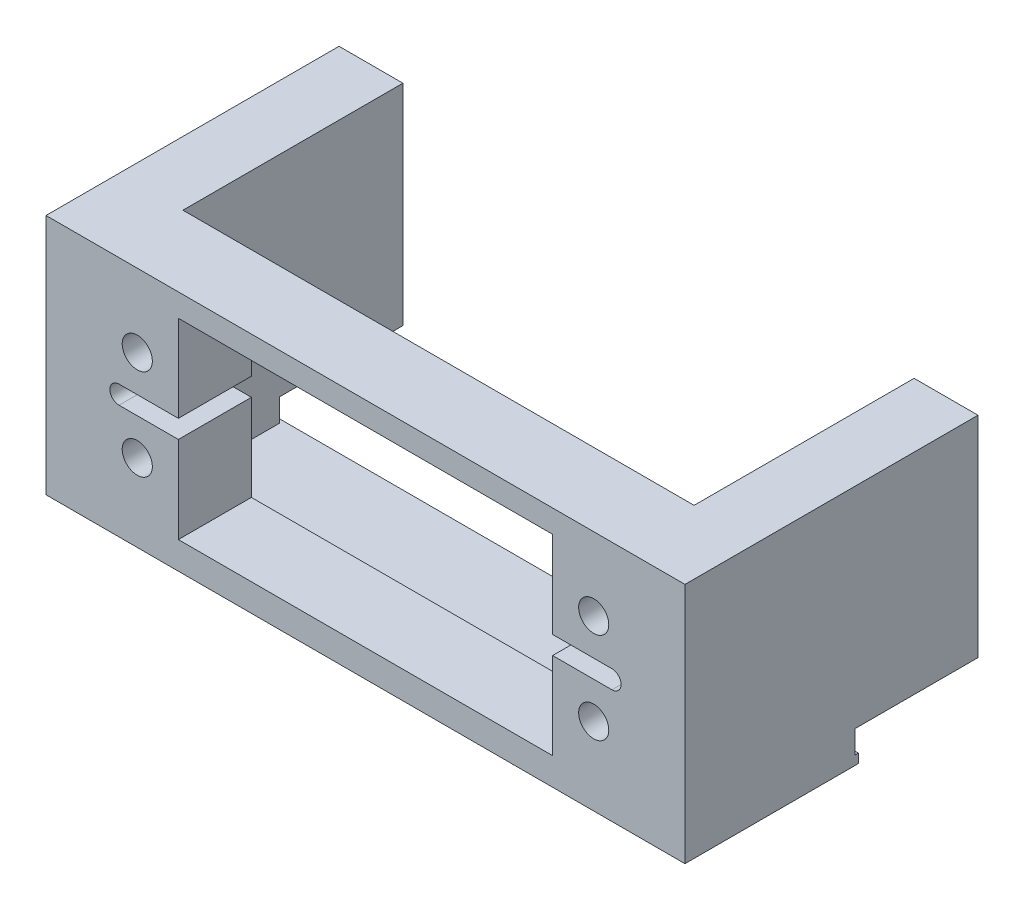
ISO-10303-21;
HEADER;
FILE_DESCRIPTION(('STEP AP214'),'2;1');
FILE_NAME('part.step','',(''),(''),'','','');
FILE_SCHEMA(('AUTOMOTIVE_DESIGN { 1 0 10303 214 1 1 1 1 }'));
ENDSEC;
DATA;
#1=APPLICATION_CONTEXT('core data for automotive mechanical design processes');
#2=APPLICATION_PROTOCOL_DEFINITION('international standard','automotive_design',2000,#1);
#3=PRODUCT_CONTEXT('',#1,'mechanical');
#4=PRODUCT('Part','Part','',(#3));
#5=PRODUCT_RELATED_PRODUCT_CATEGORY('part','',(#4));
#6=PRODUCT_DEFINITION_FORMATION('','',#4);
#7=PRODUCT_DEFINITION_CONTEXT('part definition',#1,'design');
#8=PRODUCT_DEFINITION('design','',#6,#7);
#9=PRODUCT_DEFINITION_SHAPE('','',#8);
#10=(LENGTH_UNIT() NAMED_UNIT(*) SI_UNIT(.MILLI.,.METRE.));
#11=(NAMED_UNIT(*) PLANE_ANGLE_UNIT() SI_UNIT($,.RADIAN.));
#12=(NAMED_UNIT(*) SI_UNIT($,.STERADIAN.) SOLID_ANGLE_UNIT());
#13=UNCERTAINTY_MEASURE_WITH_UNIT(LENGTH_MEASURE(1.E-05),#10,'distance_accuracy_value','');
#14=(GEOMETRIC_REPRESENTATION_CONTEXT(3) GLOBAL_UNCERTAINTY_ASSIGNED_CONTEXT((#13)) GLOBAL_UNIT_ASSIGNED_CONTEXT((#10,
#11,#12)) REPRESENTATION_CONTEXT('',''));
#15=CARTESIAN_POINT('',(0.,0.,0.));
#16=DIRECTION('',(0.,0.,1.));
#17=DIRECTION('',(1.,0.,0.));
#18=AXIS2_PLACEMENT_3D('',#15,#16,#17);
#19=CARTESIAN_POINT('',(0.,0.,-24.1));
#20=DIRECTION('',(0.,0.,-1.));
#21=DIRECTION('',(-1.,0.,0.));
#22=AXIS2_PLACEMENT_3D('',#19,#20,#21);
#23=PLANE('',#22);
#24=CARTESIAN_POINT('',(31.5,0.,-24.1));
#25=DIRECTION('',(0.,0.,-1.));
#26=DIRECTION('',(-1.,0.,0.));
#27=AXIS2_PLACEMENT_3D('',#24,#25,#26);
#28=CIRCLE('',#27,1.65);
#29=CARTESIAN_POINT('',(29.85,0.,-24.1));
#30=VERTEX_POINT('',#29);
#31=EDGE_CURVE('E296',#30,#30,#28,.T.);
#32=ORIENTED_EDGE('',*,*,#31,.F.);
#33=EDGE_LOOP('',(#32));
#34=FACE_BOUND('',#33,.T.);
#35=DIRECTION('',(0.,-1.,0.));
#36=VECTOR('',#35,1.);
#37=CARTESIAN_POINT('',(35.,0.,-24.1));
#38=LINE('',#37,#36);
#39=CARTESIAN_POINT('',(35.,12.5,-24.1));
#40=VERTEX_POINT('',#39);
#41=CARTESIAN_POINT('',(35.,-10.5,-24.1));
#42=VERTEX_POINT('',#41);
#43=EDGE_CURVE('E320',#40,#42,#38,.T.);
#44=ORIENTED_EDGE('',*,*,#43,.T.);
#45=DIRECTION('',(1.,0.,0.));
#46=VECTOR('',#45,1.);
#47=CARTESIAN_POINT('',(35.,-10.5,-24.1));
#48=LINE('',#47,#46);
#49=CARTESIAN_POINT('',(28.,-10.5,-24.1));
#50=VERTEX_POINT('',#49);
#51=EDGE_CURVE('E291',#50,#42,#48,.T.);
#52=ORIENTED_EDGE('',*,*,#51,.F.);
#53=DIRECTION('',(0.,1.,0.));
#54=VECTOR('',#53,1.);
#55=CARTESIAN_POINT('',(28.,0.,-24.1));
#56=LINE('',#55,#54);
#57=CARTESIAN_POINT('',(28.,12.5,-24.1));
#58=VERTEX_POINT('',#57);
#59=EDGE_CURVE('E314',#50,#58,#56,.T.);
#60=ORIENTED_EDGE('',*,*,#59,.T.);
#61=DIRECTION('',(1.,0.,0.));
#62=VECTOR('',#61,1.);
#63=CARTESIAN_POINT('',(0.,12.5,-24.1));
#64=LINE('',#63,#62);
#65=EDGE_CURVE('E316',#58,#40,#64,.T.);
#66=ORIENTED_EDGE('',*,*,#65,.T.);
#67=EDGE_LOOP('',(#44,#52,#60,#66));
#68=FACE_BOUND('',#67,.T.);
#69=ADVANCED_FACE('F37',(#34,#68),#23,.T.);
#70=CARTESIAN_POINT('',(0.,0.,0.));
#71=DIRECTION('',(0.,0.,1.));
#72=DIRECTION('',(1.,0.,0.));
#73=AXIS2_PLACEMENT_3D('',#70,#71,#72);
#74=PLANE('',#73);
#75=CARTESIAN_POINT('',(25.,-5.50000000000001,0.));
#76=DIRECTION('',(0.,0.,1.));
#77=DIRECTION('',(1.,0.,0.));
#78=AXIS2_PLACEMENT_3D('',#75,#76,#77);
#79=CIRCLE('',#78,1.65);
#80=CARTESIAN_POINT('',(26.65,-5.50000000000001,0.));
#81=VERTEX_POINT('',#80);
#82=EDGE_CURVE('E931',#81,#81,#79,.T.);
#83=ORIENTED_EDGE('',*,*,#82,.T.);
#84=EDGE_LOOP('',(#83));
#85=FACE_BOUND('',#84,.T.);
#86=CARTESIAN_POINT('',(-25.,-5.50000000000001,0.));
#87=DIRECTION('',(0.,0.,1.));
#88=DIRECTION('',(1.,0.,0.));
#89=AXIS2_PLACEMENT_3D('',#86,#87,#88);
#90=CIRCLE('',#89,1.65);
#91=CARTESIAN_POINT('',(-23.35,-5.50000000000001,0.));
#92=VERTEX_POINT('',#91);
#93=EDGE_CURVE('E918',#92,#92,#90,.T.);
#94=ORIENTED_EDGE('',*,*,#93,.T.);
#95=EDGE_LOOP('',(#94));
#96=FACE_BOUND('',#95,.T.);
#97=DIRECTION('',(0.,1.,0.));
#98=VECTOR('',#97,1.);
#99=CARTESIAN_POINT('',(28.,0.,0.));
#100=LINE('',#99,#98);
#101=CARTESIAN_POINT('',(28.,-13.,0.));
#102=VERTEX_POINT('',#101);
#103=CARTESIAN_POINT('',(28.,-0.500000000000009,0.));
#104=VERTEX_POINT('',#103);
#105=EDGE_CURVE('E317',#102,#104,#100,.T.);
#106=ORIENTED_EDGE('',*,*,#105,.F.);
#107=DIRECTION('',(1.,0.,0.));
#108=VECTOR('',#107,1.);
#109=CARTESIAN_POINT('',(28.,-13.,0.));
#110=LINE('',#109,#108);
#111=CARTESIAN_POINT('',(-28.,-13.,0.));
#112=VERTEX_POINT('',#111);
#113=EDGE_CURVE('E275',#112,#102,#110,.T.);
#114=ORIENTED_EDGE('',*,*,#113,.F.);
#115=DIRECTION('',(0.,1.,0.));
#116=VECTOR('',#115,1.);
#117=CARTESIAN_POINT('',(-28.,0.,0.));
#118=LINE('',#117,#116);
#119=CARTESIAN_POINT('',(-28.,-0.500000000000009,0.));
#120=VERTEX_POINT('',#119);
#121=EDGE_CURVE('E350',#112,#120,#118,.T.);
#122=ORIENTED_EDGE('',*,*,#121,.T.);
#123=CARTESIAN_POINT('',(-27.,-0.500000000000009,0.));
#124=DIRECTION('',(0.,0.,1.));
#125=DIRECTION('',(1.,0.,0.));
#126=AXIS2_PLACEMENT_3D('',#123,#124,#125);
#127=CIRCLE('',#126,0.999999999999997);
#128=CARTESIAN_POINT('',(-27.,-1.50000000000001,0.));
#129=VERTEX_POINT('',#128);
#130=EDGE_CURVE('E370',#120,#129,#127,.T.);
#131=ORIENTED_EDGE('',*,*,#130,.T.);
#132=DIRECTION('',(1.,0.,0.));
#133=VECTOR('',#132,1.);
#134=CARTESIAN_POINT('',(-27.,-1.50000000000001,0.));
#135=LINE('',#134,#133);
#136=CARTESIAN_POINT('',(-20.5,-1.50000000000001,0.));
#137=VERTEX_POINT('',#136);
#138=EDGE_CURVE('E369',#129,#137,#135,.T.);
#139=ORIENTED_EDGE('',*,*,#138,.T.);
#140=DIRECTION('',(0.,1.,0.));
#141=VECTOR('',#140,1.);
#142=CARTESIAN_POINT('',(-20.5,-11.,0.));
#143=LINE('',#142,#141);
#144=CARTESIAN_POINT('',(-20.5,-11.,0.));
#145=VERTEX_POINT('',#144);
#146=EDGE_CURVE('E395',#145,#137,#143,.T.);
#147=ORIENTED_EDGE('',*,*,#146,.F.);
#148=DIRECTION('',(-1.,0.,0.));
#149=VECTOR('',#148,1.);
#150=CARTESIAN_POINT('',(-20.5,-11.,0.));
#151=LINE('',#150,#149);
#152=CARTESIAN_POINT('',(20.5,-11.,0.));
#153=VERTEX_POINT('',#152);
#154=EDGE_CURVE('E391',#153,#145,#151,.T.);
#155=ORIENTED_EDGE('',*,*,#154,.F.);
#156=DIRECTION('',(0.,-1.,0.));
#157=VECTOR('',#156,1.);
#158=CARTESIAN_POINT('',(20.5,-11.,0.));
#159=LINE('',#158,#157);
#160=CARTESIAN_POINT('',(20.5,-1.5,0.));
#161=VERTEX_POINT('',#160);
#162=EDGE_CURVE('E386',#161,#153,#159,.T.);
#163=ORIENTED_EDGE('',*,*,#162,.F.);
#164=DIRECTION('',(-1.,0.,0.));
#165=VECTOR('',#164,1.);
#166=CARTESIAN_POINT('',(0.,-1.5,0.));
#167=LINE('',#166,#165);
#168=CARTESIAN_POINT('',(27.,-1.50000000000001,0.));
#169=VERTEX_POINT('',#168);
#170=EDGE_CURVE('E342',#169,#161,#167,.T.);
#171=ORIENTED_EDGE('',*,*,#170,.F.);
#172=CARTESIAN_POINT('',(27.,-0.500000000000009,0.));
#173=DIRECTION('',(0.,0.,1.));
#174=DIRECTION('',(1.,0.,0.));
#175=AXIS2_PLACEMENT_3D('',#172,#173,#174);
#176=CIRCLE('',#175,0.999999999999997);
#177=EDGE_CURVE('E45',#104,#169,#176,.F.);
#178=ORIENTED_EDGE('',*,*,#177,.F.);
#179=EDGE_LOOP('',(#106,#114,#122,#131,#139,#147,#155,#163,#171,#178));
#180=FACE_BOUND('',#179,.T.);
#181=ADVANCED_FACE('F451',(#85,#96,#180),#74,.F.);
#182=CARTESIAN_POINT('',(-25.,4.49999999999999,0.));
#183=DIRECTION('',(0.,0.,1.));
#184=DIRECTION('',(1.,0.,0.));
#185=AXIS2_PLACEMENT_3D('',#182,#183,#184);
#186=CIRCLE('',#185,1.65);
#187=CARTESIAN_POINT('',(-23.35,4.49999999999999,0.));
#188=VERTEX_POINT('',#187);
#189=EDGE_CURVE('E913',#188,#188,#186,.T.);
#190=ORIENTED_EDGE('',*,*,#189,.T.);
#191=EDGE_LOOP('',(#190));
#192=FACE_BOUND('',#191,.T.);
#193=CARTESIAN_POINT('',(25.,4.49999999999999,0.));
#194=DIRECTION('',(0.,0.,1.));
#195=DIRECTION('',(1.,0.,0.));
#196=AXIS2_PLACEMENT_3D('',#193,#194,#195);
#197=CIRCLE('',#196,1.65);
#198=CARTESIAN_POINT('',(26.65,4.49999999999999,0.));
#199=VERTEX_POINT('',#198);
#200=EDGE_CURVE('E255',#199,#199,#197,.T.);
#201=ORIENTED_EDGE('',*,*,#200,.T.);
#202=EDGE_LOOP('',(#201));
#203=FACE_BOUND('',#202,.T.);
#204=CARTESIAN_POINT('',(28.,12.5,0.));
#205=VERTEX_POINT('',#204);
#206=EDGE_CURVE('E313',#104,#205,#100,.T.);
#207=ORIENTED_EDGE('',*,*,#206,.F.);
#208=CARTESIAN_POINT('',(27.,0.499999999999988,0.));
#209=VERTEX_POINT('',#208);
#210=EDGE_CURVE('E11',#209,#104,#176,.F.);
#211=ORIENTED_EDGE('',*,*,#210,.F.);
#212=DIRECTION('',(1.,0.,0.));
#213=VECTOR('',#212,1.);
#214=CARTESIAN_POINT('',(0.,0.499999999999993,0.));
#215=LINE('',#214,#213);
#216=CARTESIAN_POINT('',(20.5,0.49999999999999,0.));
#217=VERTEX_POINT('',#216);
#218=EDGE_CURVE('E339',#217,#209,#215,.T.);
#219=ORIENTED_EDGE('',*,*,#218,.F.);
#220=CARTESIAN_POINT('',(20.5,9.99999999999999,0.));
#221=VERTEX_POINT('',#220);
#222=EDGE_CURVE('E388',#221,#217,#159,.T.);
#223=ORIENTED_EDGE('',*,*,#222,.F.);
#224=DIRECTION('',(1.,0.,0.));
#225=VECTOR('',#224,1.);
#226=CARTESIAN_POINT('',(-20.5,9.99999999999999,0.));
#227=LINE('',#226,#225);
#228=CARTESIAN_POINT('',(-20.5,9.99999999999999,0.));
#229=VERTEX_POINT('',#228);
#230=EDGE_CURVE('E398',#229,#221,#227,.T.);
#231=ORIENTED_EDGE('',*,*,#230,.F.);
#232=CARTESIAN_POINT('',(-20.5,0.49999999999999,0.));
#233=VERTEX_POINT('',#232);
#234=EDGE_CURVE('E394',#233,#229,#143,.T.);
#235=ORIENTED_EDGE('',*,*,#234,.F.);
#236=DIRECTION('',(-1.,0.,0.));
#237=VECTOR('',#236,1.);
#238=CARTESIAN_POINT('',(-27.,0.499999999999988,0.));
#239=LINE('',#238,#237);
#240=CARTESIAN_POINT('',(-27.,0.499999999999988,0.));
#241=VERTEX_POINT('',#240);
#242=EDGE_CURVE('E373',#233,#241,#239,.T.);
#243=ORIENTED_EDGE('',*,*,#242,.T.);
#244=EDGE_CURVE('E366',#241,#120,#127,.T.);
#245=ORIENTED_EDGE('',*,*,#244,.T.);
#246=CARTESIAN_POINT('',(-28.,12.5,0.));
#247=VERTEX_POINT('',#246);
#248=EDGE_CURVE('E362',#120,#247,#118,.T.);
#249=ORIENTED_EDGE('',*,*,#248,.T.);
#250=DIRECTION('',(-1.,0.,0.));
#251=VECTOR('',#250,1.);
#252=CARTESIAN_POINT('',(-35.,12.5,0.));
#253=LINE('',#252,#251);
#254=EDGE_CURVE('E234',#205,#247,#253,.T.);
#255=ORIENTED_EDGE('',*,*,#254,.F.);
#256=EDGE_LOOP('',(#207,#211,#219,#223,#231,#235,#243,#245,#249,#255));
#257=FACE_BOUND('',#256,.T.);
#258=ADVANCED_FACE('F469',(#192,#203,#257),#74,.F.);
#259=CARTESIAN_POINT('',(0.,0.,8.));
#260=DIRECTION('',(0.,0.,1.));
#261=DIRECTION('',(1.,0.,0.));
#262=AXIS2_PLACEMENT_3D('',#259,#260,#261);
#263=PLANE('',#262);
#264=CARTESIAN_POINT('',(25.,-5.50000000000001,8.));
#265=DIRECTION('',(0.,0.,1.));
#266=DIRECTION('',(1.,0.,0.));
#267=AXIS2_PLACEMENT_3D('',#264,#265,#266);
#268=CIRCLE('',#267,1.65);
#269=CARTESIAN_POINT('',(26.65,-5.50000000000001,8.));
#270=VERTEX_POINT('',#269);
#271=EDGE_CURVE('E934',#270,#270,#268,.T.);
#272=ORIENTED_EDGE('',*,*,#271,.F.);
#273=EDGE_LOOP('',(#272));
#274=FACE_BOUND('',#273,.T.);
#275=CARTESIAN_POINT('',(-25.,4.49999999999999,8.));
#276=DIRECTION('',(0.,0.,1.));
#277=DIRECTION('',(1.,0.,0.));
#278=AXIS2_PLACEMENT_3D('',#275,#276,#277);
#279=CIRCLE('',#278,1.65);
#280=CARTESIAN_POINT('',(-23.35,4.49999999999999,8.));
#281=VERTEX_POINT('',#280);
#282=EDGE_CURVE('E928',#281,#281,#279,.T.);
#283=ORIENTED_EDGE('',*,*,#282,.F.);
#284=EDGE_LOOP('',(#283));
#285=FACE_BOUND('',#284,.T.);
#286=CARTESIAN_POINT('',(-25.,-5.50000000000001,8.));
#287=DIRECTION('',(0.,0.,1.));
#288=DIRECTION('',(1.,0.,0.));
#289=AXIS2_PLACEMENT_3D('',#286,#287,#288);
#290=CIRCLE('',#289,1.65);
#291=CARTESIAN_POINT('',(-23.35,-5.50000000000001,8.));
#292=VERTEX_POINT('',#291);
#293=EDGE_CURVE('E922',#292,#292,#290,.T.);
#294=ORIENTED_EDGE('',*,*,#293,.F.);
#295=EDGE_LOOP('',(#294));
#296=FACE_BOUND('',#295,.T.);
#297=CARTESIAN_POINT('',(25.,4.49999999999999,8.));
#298=DIRECTION('',(0.,0.,1.));
#299=DIRECTION('',(1.,0.,0.));
#300=AXIS2_PLACEMENT_3D('',#297,#298,#299);
#301=CIRCLE('',#300,1.65);
#302=CARTESIAN_POINT('',(26.65,4.49999999999999,8.));
#303=VERTEX_POINT('',#302);
#304=EDGE_CURVE('E916',#303,#303,#301,.T.);
#305=ORIENTED_EDGE('',*,*,#304,.F.);
#306=EDGE_LOOP('',(#305));
#307=FACE_BOUND('',#306,.T.);
#308=DIRECTION('',(0.,1.,0.));
#309=VECTOR('',#308,1.);
#310=CARTESIAN_POINT('',(35.,12.5,8.));
#311=LINE('',#310,#309);
#312=CARTESIAN_POINT('',(35.,-14.,8.));
#313=VERTEX_POINT('',#312);
#314=CARTESIAN_POINT('',(35.,12.5,8.));
#315=VERTEX_POINT('',#314);
#316=EDGE_CURVE('E225',#313,#315,#311,.T.);
#317=ORIENTED_EDGE('',*,*,#316,.T.);
#318=DIRECTION('',(-1.,0.,0.));
#319=VECTOR('',#318,1.);
#320=CARTESIAN_POINT('',(-35.,12.5,8.));
#321=LINE('',#320,#319);
#322=CARTESIAN_POINT('',(-35.,12.5,8.));
#323=VERTEX_POINT('',#322);
#324=EDGE_CURVE('E233',#315,#323,#321,.T.);
#325=ORIENTED_EDGE('',*,*,#324,.T.);
#326=DIRECTION('',(0.,-1.,0.));
#327=VECTOR('',#326,1.);
#328=CARTESIAN_POINT('',(-35.,12.5,8.));
#329=LINE('',#328,#327);
#330=CARTESIAN_POINT('',(-35.,-14.,7.99999999999999));
#331=VERTEX_POINT('',#330);
#332=EDGE_CURVE('E241',#323,#331,#329,.T.);
#333=ORIENTED_EDGE('',*,*,#332,.T.);
#334=DIRECTION('',(-1.,0.,0.));
#335=VECTOR('',#334,1.);
#336=CARTESIAN_POINT('',(35.,-14.,8.));
#337=LINE('',#336,#335);
#338=EDGE_CURVE('E237',#313,#331,#337,.T.);
#339=ORIENTED_EDGE('',*,*,#338,.F.);
#340=EDGE_LOOP('',(#317,#325,#333,#339));
#341=FACE_BOUND('',#340,.T.);
#342=CARTESIAN_POINT('',(27.,-0.500000000000009,8.));
#343=DIRECTION('',(0.,0.,-1.));
#344=DIRECTION('',(-1.,0.,0.));
#345=AXIS2_PLACEMENT_3D('',#342,#343,#344);
#346=CIRCLE('',#345,0.999999999999997);
#347=CARTESIAN_POINT('',(27.,0.499999999999988,8.));
#348=VERTEX_POINT('',#347);
#349=CARTESIAN_POINT('',(27.,-1.50000000000001,8.));
#350=VERTEX_POINT('',#349);
#351=EDGE_CURVE('E327',#348,#350,#346,.T.);
#352=ORIENTED_EDGE('',*,*,#351,.T.);
#353=DIRECTION('',(-1.,0.,0.));
#354=VECTOR('',#353,1.);
#355=CARTESIAN_POINT('',(27.,-1.50000000000001,8.));
#356=LINE('',#355,#354);
#357=CARTESIAN_POINT('',(20.5,-1.50000000000001,8.));
#358=VERTEX_POINT('',#357);
#359=EDGE_CURVE('E333',#350,#358,#356,.T.);
#360=ORIENTED_EDGE('',*,*,#359,.T.);
#361=DIRECTION('',(0.,1.,0.));
#362=VECTOR('',#361,1.);
#363=CARTESIAN_POINT('',(20.5,0.,8.));
#364=LINE('',#363,#362);
#365=CARTESIAN_POINT('',(20.5,-11.,8.));
#366=VERTEX_POINT('',#365);
#367=EDGE_CURVE('E420',#366,#358,#364,.T.);
#368=ORIENTED_EDGE('',*,*,#367,.F.);
#369=DIRECTION('',(1.,0.,0.));
#370=VECTOR('',#369,1.);
#371=CARTESIAN_POINT('',(0.,-11.,8.));
#372=LINE('',#371,#370);
#373=CARTESIAN_POINT('',(-20.5,-11.,8.));
#374=VERTEX_POINT('',#373);
#375=EDGE_CURVE('E404',#374,#366,#372,.T.);
#376=ORIENTED_EDGE('',*,*,#375,.F.);
#377=DIRECTION('',(0.,-1.,0.));
#378=VECTOR('',#377,1.);
#379=CARTESIAN_POINT('',(-20.5,0.,8.));
#380=LINE('',#379,#378);
#381=CARTESIAN_POINT('',(-20.5,-1.50000000000001,8.));
#382=VERTEX_POINT('',#381);
#383=EDGE_CURVE('E413',#382,#374,#380,.T.);
#384=ORIENTED_EDGE('',*,*,#383,.F.);
#385=DIRECTION('',(1.,0.,0.));
#386=VECTOR('',#385,1.);
#387=CARTESIAN_POINT('',(-27.,-1.50000000000001,8.));
#388=LINE('',#387,#386);
#389=CARTESIAN_POINT('',(-27.,-1.50000000000001,8.));
#390=VERTEX_POINT('',#389);
#391=EDGE_CURVE('E379',#390,#382,#388,.T.);
#392=ORIENTED_EDGE('',*,*,#391,.F.);
#393=CARTESIAN_POINT('',(-27.,-0.500000000000009,8.));
#394=DIRECTION('',(0.,0.,1.));
#395=DIRECTION('',(1.,0.,0.));
#396=AXIS2_PLACEMENT_3D('',#393,#394,#395);
#397=CIRCLE('',#396,0.999999999999997);
#398=CARTESIAN_POINT('',(-27.,0.499999999999988,8.));
#399=VERTEX_POINT('',#398);
#400=EDGE_CURVE('E365',#399,#390,#397,.T.);
#401=ORIENTED_EDGE('',*,*,#400,.F.);
#402=DIRECTION('',(-1.,0.,0.));
#403=VECTOR('',#402,1.);
#404=CARTESIAN_POINT('',(-27.,0.499999999999988,8.));
#405=LINE('',#404,#403);
#406=CARTESIAN_POINT('',(-20.5,0.49999999999999,8.));
#407=VERTEX_POINT('',#406);
#408=EDGE_CURVE('E381',#407,#399,#405,.T.);
#409=ORIENTED_EDGE('',*,*,#408,.F.);
#410=CARTESIAN_POINT('',(-20.5,9.99999999999999,8.));
#411=VERTEX_POINT('',#410);
#412=EDGE_CURVE('E414',#411,#407,#380,.T.);
#413=ORIENTED_EDGE('',*,*,#412,.F.);
#414=DIRECTION('',(-1.,0.,0.));
#415=VECTOR('',#414,1.);
#416=CARTESIAN_POINT('',(0.,9.99999999999999,8.));
#417=LINE('',#416,#415);
#418=CARTESIAN_POINT('',(20.5,9.99999999999999,8.));
#419=VERTEX_POINT('',#418);
#420=EDGE_CURVE('E417',#419,#411,#417,.T.);
#421=ORIENTED_EDGE('',*,*,#420,.F.);
#422=CARTESIAN_POINT('',(20.5,0.499999999999992,8.));
#423=VERTEX_POINT('',#422);
#424=EDGE_CURVE('E419',#423,#419,#364,.T.);
#425=ORIENTED_EDGE('',*,*,#424,.F.);
#426=DIRECTION('',(1.,0.,0.));
#427=VECTOR('',#426,1.);
#428=CARTESIAN_POINT('',(27.,0.499999999999988,8.));
#429=LINE('',#428,#427);
#430=EDGE_CURVE('E330',#423,#348,#429,.T.);
#431=ORIENTED_EDGE('',*,*,#430,.T.);
#432=EDGE_LOOP('',(#352,#360,#368,#376,#384,#392,#401,#409,#413,#421,#425,#431));
#433=FACE_BOUND('',#432,.T.);
#434=ADVANCED_FACE('F238',(#274,#285,#296,#307,#341,#433),#263,.T.);
#435=CARTESIAN_POINT('',(20.5,-11.,24.));
#436=DIRECTION('',(1.,0.,0.));
#437=DIRECTION('',(0.,0.,-1.));
#438=AXIS2_PLACEMENT_3D('',#435,#436,#437);
#439=PLANE('',#438);
#440=DIRECTION('',(0.,0.,1.));
#441=VECTOR('',#440,1.);
#442=CARTESIAN_POINT('',(20.5,-1.5,24.));
#443=LINE('',#442,#441);
#444=EDGE_CURVE('E436',#161,#358,#443,.T.);
#445=ORIENTED_EDGE('',*,*,#444,.F.);
#446=ORIENTED_EDGE('',*,*,#162,.T.);
#447=DIRECTION('',(0.,0.,-1.));
#448=VECTOR('',#447,1.);
#449=CARTESIAN_POINT('',(20.5,-11.,24.));
#450=LINE('',#449,#448);
#451=EDGE_CURVE('E401',#366,#153,#450,.T.);
#452=ORIENTED_EDGE('',*,*,#451,.F.);
#453=ORIENTED_EDGE('',*,*,#367,.T.);
#454=EDGE_LOOP('',(#445,#446,#452,#453));
#455=FACE_BOUND('',#454,.T.);
#456=ADVANCED_FACE('F456',(#455),#439,.F.);
#457=DIRECTION('',(0.,0.,-1.));
#458=VECTOR('',#457,1.);
#459=CARTESIAN_POINT('',(20.5,0.49999999999999,24.));
#460=LINE('',#459,#458);
#461=EDGE_CURVE('E435',#423,#217,#460,.T.);
#462=ORIENTED_EDGE('',*,*,#461,.F.);
#463=ORIENTED_EDGE('',*,*,#424,.T.);
#464=DIRECTION('',(0.,0.,-1.));
#465=VECTOR('',#464,1.);
#466=CARTESIAN_POINT('',(20.5,9.99999999999999,24.));
#467=LINE('',#466,#465);
#468=EDGE_CURVE('E402',#419,#221,#467,.T.);
#469=ORIENTED_EDGE('',*,*,#468,.T.);
#470=ORIENTED_EDGE('',*,*,#222,.T.);
#471=EDGE_LOOP('',(#462,#463,#469,#470));
#472=FACE_BOUND('',#471,.T.);
#473=ADVANCED_FACE('F529',(#472),#439,.F.);
#474=CARTESIAN_POINT('',(-20.5,-11.,24.));
#475=DIRECTION('',(-1.,0.,0.));
#476=DIRECTION('',(0.,0.,1.));
#477=AXIS2_PLACEMENT_3D('',#474,#475,#476);
#478=PLANE('',#477);
#479=ORIENTED_EDGE('',*,*,#412,.T.);
#480=DIRECTION('',(0.,0.,-1.));
#481=VECTOR('',#480,1.);
#482=CARTESIAN_POINT('',(-20.5,0.49999999999999,24.));
#483=LINE('',#482,#481);
#484=EDGE_CURVE('E432',#407,#233,#483,.T.);
#485=ORIENTED_EDGE('',*,*,#484,.T.);
#486=ORIENTED_EDGE('',*,*,#234,.T.);
#487=DIRECTION('',(0.,0.,-1.));
#488=VECTOR('',#487,1.);
#489=CARTESIAN_POINT('',(-20.5,9.99999999999999,24.));
#490=LINE('',#489,#488);
#491=EDGE_CURVE('E405',#411,#229,#490,.T.);
#492=ORIENTED_EDGE('',*,*,#491,.F.);
#493=EDGE_LOOP('',(#479,#485,#486,#492));
#494=FACE_BOUND('',#493,.T.);
#495=ADVANCED_FACE('F508',(#494),#478,.F.);
#496=CARTESIAN_POINT('',(35.,12.5,8.));
#497=DIRECTION('',(-1.,0.,0.));
#498=DIRECTION('',(0.,-1.,0.));
#499=AXIS2_PLACEMENT_3D('',#496,#497,#498);
#500=PLANE('',#499);
#501=ORIENTED_EDGE('',*,*,#316,.F.);
#502=DIRECTION('',(0.,0.,1.));
#503=VECTOR('',#502,1.);
#504=CARTESIAN_POINT('',(35.,-14.,8.));
#505=LINE('',#504,#503);
#506=CARTESIAN_POINT('',(35.,-14.,-11.));
#507=VERTEX_POINT('',#506);
#508=EDGE_CURVE('E229',#507,#313,#505,.T.);
#509=ORIENTED_EDGE('',*,*,#508,.F.);
#510=DIRECTION('',(0.,1.,0.));
#511=VECTOR('',#510,1.);
#512=CARTESIAN_POINT('',(35.,-14.,-11.));
#513=LINE('',#512,#511);
#514=CARTESIAN_POINT('',(35.,-13.,-11.));
#515=VERTEX_POINT('',#514);
#516=EDGE_CURVE('E260',#507,#515,#513,.T.);
#517=ORIENTED_EDGE('',*,*,#516,.T.);
#518=DIRECTION('',(0.,0.,1.));
#519=VECTOR('',#518,1.);
#520=CARTESIAN_POINT('',(35.,-13.,8.));
#521=LINE('',#520,#519);
#522=CARTESIAN_POINT('',(35.,-13.,-10.6));
#523=VERTEX_POINT('',#522);
#524=EDGE_CURVE('E261',#515,#523,#521,.T.);
#525=ORIENTED_EDGE('',*,*,#524,.T.);
#526=DIRECTION('',(0.,-1.,0.));
#527=VECTOR('',#526,1.);
#528=CARTESIAN_POINT('',(35.,-10.5,-10.6));
#529=LINE('',#528,#527);
#530=CARTESIAN_POINT('',(35.,-10.5,-10.6));
#531=VERTEX_POINT('',#530);
#532=EDGE_CURVE('E293',#531,#523,#529,.T.);
#533=ORIENTED_EDGE('',*,*,#532,.F.);
#534=DIRECTION('',(0.,0.,1.));
#535=VECTOR('',#534,1.);
#536=CARTESIAN_POINT('',(35.,-10.5,-24.1));
#537=LINE('',#536,#535);
#538=EDGE_CURVE('E284',#42,#531,#537,.T.);
#539=ORIENTED_EDGE('',*,*,#538,.F.);
#540=ORIENTED_EDGE('',*,*,#43,.F.);
#541=DIRECTION('',(0.,0.,-1.));
#542=VECTOR('',#541,1.);
#543=CARTESIAN_POINT('',(35.,12.5,8.));
#544=LINE('',#543,#542);
#545=EDGE_CURVE('E231',#315,#40,#544,.T.);
#546=ORIENTED_EDGE('',*,*,#545,.F.);
#547=EDGE_LOOP('',(#501,#509,#517,#525,#533,#539,#540,#546));
#548=FACE_BOUND('',#547,.T.);
#549=ADVANCED_FACE('F39',(#548),#500,.F.);
#550=CARTESIAN_POINT('',(-35.,12.5,8.));
#551=DIRECTION('',(0.,-1.,0.));
#552=DIRECTION('',(0.,0.,-1.));
#553=AXIS2_PLACEMENT_3D('',#550,#551,#552);
#554=PLANE('',#553);
#555=ORIENTED_EDGE('',*,*,#545,.T.);
#556=ORIENTED_EDGE('',*,*,#65,.F.);
#557=DIRECTION('',(0.,0.,1.));
#558=VECTOR('',#557,1.);
#559=CARTESIAN_POINT('',(28.,12.5,-24.1));
#560=LINE('',#559,#558);
#561=EDGE_CURVE('E323',#58,#205,#560,.T.);
#562=ORIENTED_EDGE('',*,*,#561,.T.);
#563=ORIENTED_EDGE('',*,*,#254,.T.);
#564=DIRECTION('',(0.,0.,1.));
#565=VECTOR('',#564,1.);
#566=CARTESIAN_POINT('',(-28.,12.5,-24.1));
#567=LINE('',#566,#565);
#568=CARTESIAN_POINT('',(-28.,12.5,-24.1));
#569=VERTEX_POINT('',#568);
#570=EDGE_CURVE('E359',#569,#247,#567,.T.);
#571=ORIENTED_EDGE('',*,*,#570,.F.);
#572=DIRECTION('',(-1.,0.,0.));
#573=VECTOR('',#572,1.);
#574=CARTESIAN_POINT('',(0.,12.5,-24.1));
#575=LINE('',#574,#573);
#576=CARTESIAN_POINT('',(-35.,12.5,-24.1));
#577=VERTEX_POINT('',#576);
#578=EDGE_CURVE('E356',#569,#577,#575,.T.);
#579=ORIENTED_EDGE('',*,*,#578,.T.);
#580=DIRECTION('',(0.,0.,-1.));
#581=VECTOR('',#580,1.);
#582=CARTESIAN_POINT('',(-35.,12.5,8.));
#583=LINE('',#582,#581);
#584=EDGE_CURVE('E425',#323,#577,#583,.T.);
#585=ORIENTED_EDGE('',*,*,#584,.F.);
#586=ORIENTED_EDGE('',*,*,#324,.F.);
#587=EDGE_LOOP('',(#555,#556,#562,#563,#571,#579,#585,#586));
#588=FACE_BOUND('',#587,.T.);
#589=ADVANCED_FACE('F480',(#588),#554,.F.);
#590=CARTESIAN_POINT('',(-35.,12.5,8.));
#591=DIRECTION('',(1.,0.,0.));
#592=DIRECTION('',(0.,0.,-1.));
#593=AXIS2_PLACEMENT_3D('',#590,#591,#592);
#594=PLANE('',#593);
#595=DIRECTION('',(0.,0.,-1.));
#596=VECTOR('',#595,1.);
#597=CARTESIAN_POINT('',(-35.,-10.5,-24.1));
#598=LINE('',#597,#596);
#599=CARTESIAN_POINT('',(-35.,-10.5,-10.6));
#600=VERTEX_POINT('',#599);
#601=CARTESIAN_POINT('',(-35.,-10.5,-24.1));
#602=VERTEX_POINT('',#601);
#603=EDGE_CURVE('E52',#600,#602,#598,.T.);
#604=ORIENTED_EDGE('',*,*,#603,.F.);
#605=DIRECTION('',(0.,-1.,0.));
#606=VECTOR('',#605,1.);
#607=CARTESIAN_POINT('',(-35.,-10.5,-10.6));
#608=LINE('',#607,#606);
#609=CARTESIAN_POINT('',(-35.,-13.,-10.6));
#610=VERTEX_POINT('',#609);
#611=EDGE_CURVE('E288',#600,#610,#608,.T.);
#612=ORIENTED_EDGE('',*,*,#611,.T.);
#613=DIRECTION('',(0.,0.,-1.));
#614=VECTOR('',#613,1.);
#615=CARTESIAN_POINT('',(-35.,-13.,7.99999999999999));
#616=LINE('',#615,#614);
#617=CARTESIAN_POINT('',(-35.,-13.,-11.));
#618=VERTEX_POINT('',#617);
#619=EDGE_CURVE('E252',#610,#618,#616,.T.);
#620=ORIENTED_EDGE('',*,*,#619,.T.);
#621=DIRECTION('',(0.,1.,0.));
#622=VECTOR('',#621,1.);
#623=CARTESIAN_POINT('',(-35.,-14.,-11.));
#624=LINE('',#623,#622);
#625=CARTESIAN_POINT('',(-35.,-14.,-11.));
#626=VERTEX_POINT('',#625);
#627=EDGE_CURVE('E266',#626,#618,#624,.T.);
#628=ORIENTED_EDGE('',*,*,#627,.F.);
#629=DIRECTION('',(0.,0.,-1.));
#630=VECTOR('',#629,1.);
#631=CARTESIAN_POINT('',(-35.,-14.,7.99999999999999));
#632=LINE('',#631,#630);
#633=EDGE_CURVE('E244',#331,#626,#632,.T.);
#634=ORIENTED_EDGE('',*,*,#633,.F.);
#635=ORIENTED_EDGE('',*,*,#332,.F.);
#636=ORIENTED_EDGE('',*,*,#584,.T.);
#637=DIRECTION('',(0.,-1.,0.));
#638=VECTOR('',#637,1.);
#639=CARTESIAN_POINT('',(-35.,0.,-24.1));
#640=LINE('',#639,#638);
#641=EDGE_CURVE('E351',#577,#602,#640,.T.);
#642=ORIENTED_EDGE('',*,*,#641,.T.);
#643=EDGE_LOOP('',(#604,#612,#620,#628,#634,#635,#636,#642));
#644=FACE_BOUND('',#643,.T.);
#645=ADVANCED_FACE('F525',(#644),#594,.F.);
#646=CARTESIAN_POINT('',(-20.5,9.99999999999999,24.));
#647=DIRECTION('',(0.,1.,0.));
#648=DIRECTION('',(0.,0.,1.));
#649=AXIS2_PLACEMENT_3D('',#646,#647,#648);
#650=PLANE('',#649);
#651=ORIENTED_EDGE('',*,*,#420,.T.);
#652=ORIENTED_EDGE('',*,*,#491,.T.);
#653=ORIENTED_EDGE('',*,*,#230,.T.);
#654=ORIENTED_EDGE('',*,*,#468,.F.);
#655=EDGE_LOOP('',(#651,#652,#653,#654));
#656=FACE_BOUND('',#655,.T.);
#657=ADVANCED_FACE('F518',(#656),#650,.F.);
#658=ORIENTED_EDGE('',*,*,#146,.T.);
#659=DIRECTION('',(0.,0.,1.));
#660=VECTOR('',#659,1.);
#661=CARTESIAN_POINT('',(-20.5,-1.5,24.));
#662=LINE('',#661,#660);
#663=EDGE_CURVE('E429',#137,#382,#662,.T.);
#664=ORIENTED_EDGE('',*,*,#663,.T.);
#665=ORIENTED_EDGE('',*,*,#383,.T.);
#666=DIRECTION('',(0.,0.,-1.));
#667=VECTOR('',#666,1.);
#668=CARTESIAN_POINT('',(-20.5,-11.,24.));
#669=LINE('',#668,#667);
#670=EDGE_CURVE('E408',#374,#145,#669,.T.);
#671=ORIENTED_EDGE('',*,*,#670,.T.);
#672=EDGE_LOOP('',(#658,#664,#665,#671));
#673=FACE_BOUND('',#672,.T.);
#674=ADVANCED_FACE('F516',(#673),#478,.F.);
#675=CARTESIAN_POINT('',(-20.5,-11.,24.));
#676=DIRECTION('',(0.,-1.,0.));
#677=DIRECTION('',(0.,0.,-1.));
#678=AXIS2_PLACEMENT_3D('',#675,#676,#677);
#679=PLANE('',#678);
#680=ORIENTED_EDGE('',*,*,#375,.T.);
#681=ORIENTED_EDGE('',*,*,#451,.T.);
#682=ORIENTED_EDGE('',*,*,#154,.T.);
#683=ORIENTED_EDGE('',*,*,#670,.F.);
#684=EDGE_LOOP('',(#680,#681,#682,#683));
#685=FACE_BOUND('',#684,.T.);
#686=ADVANCED_FACE('F459',(#685),#679,.F.);
#687=CARTESIAN_POINT('',(-27.,0.499999999999988,0.));
#688=DIRECTION('',(0.,1.,0.));
#689=DIRECTION('',(-1.,0.,0.));
#690=AXIS2_PLACEMENT_3D('',#687,#688,#689);
#691=PLANE('',#690);
#692=ORIENTED_EDGE('',*,*,#408,.T.);
#693=DIRECTION('',(0.,0.,1.));
#694=VECTOR('',#693,1.);
#695=CARTESIAN_POINT('',(-27.,0.499999999999988,0.));
#696=LINE('',#695,#694);
#697=EDGE_CURVE('E383',#241,#399,#696,.T.);
#698=ORIENTED_EDGE('',*,*,#697,.F.);
#699=ORIENTED_EDGE('',*,*,#242,.F.);
#700=ORIENTED_EDGE('',*,*,#484,.F.);
#701=EDGE_LOOP('',(#692,#698,#699,#700));
#702=FACE_BOUND('',#701,.T.);
#703=ADVANCED_FACE('F505',(#702),#691,.F.);
#704=CARTESIAN_POINT('',(-27.,-1.50000000000001,0.));
#705=DIRECTION('',(0.,-1.,0.));
#706=DIRECTION('',(1.,0.,0.));
#707=AXIS2_PLACEMENT_3D('',#704,#705,#706);
#708=PLANE('',#707);
#709=ORIENTED_EDGE('',*,*,#138,.F.);
#710=DIRECTION('',(0.,0.,1.));
#711=VECTOR('',#710,1.);
#712=CARTESIAN_POINT('',(-27.,-1.50000000000001,0.));
#713=LINE('',#712,#711);
#714=EDGE_CURVE('E376',#129,#390,#713,.T.);
#715=ORIENTED_EDGE('',*,*,#714,.T.);
#716=ORIENTED_EDGE('',*,*,#391,.T.);
#717=ORIENTED_EDGE('',*,*,#663,.F.);
#718=EDGE_LOOP('',(#709,#715,#716,#717));
#719=FACE_BOUND('',#718,.T.);
#720=ADVANCED_FACE('F514',(#719),#708,.F.);
#721=CARTESIAN_POINT('',(-27.,-0.500000000000009,0.));
#722=DIRECTION('',(0.,0.,1.));
#723=DIRECTION('',(1.,0.,0.));
#724=AXIS2_PLACEMENT_3D('',#721,#722,#723);
#725=CYLINDRICAL_SURFACE('',#724,0.999999999999997);
#726=ORIENTED_EDGE('',*,*,#400,.T.);
#727=ORIENTED_EDGE('',*,*,#714,.F.);
#728=ORIENTED_EDGE('',*,*,#130,.F.);
#729=ORIENTED_EDGE('',*,*,#244,.F.);
#730=ORIENTED_EDGE('',*,*,#697,.T.);
#731=EDGE_LOOP('',(#726,#727,#728,#729,#730));
#732=FACE_BOUND('',#731,.T.);
#733=ADVANCED_FACE('F500',(#732),#725,.F.);
#734=CARTESIAN_POINT('',(-28.,0.,-24.1));
#735=DIRECTION('',(1.,0.,0.));
#736=DIRECTION('',(0.,1.,0.));
#737=AXIS2_PLACEMENT_3D('',#734,#735,#736);
#738=PLANE('',#737);
#739=DIRECTION('',(0.,-1.,0.));
#740=VECTOR('',#739,1.);
#741=CARTESIAN_POINT('',(-28.,-10.5,-10.6));
#742=LINE('',#741,#740);
#743=CARTESIAN_POINT('',(-28.,-10.5,-10.6));
#744=VERTEX_POINT('',#743);
#745=CARTESIAN_POINT('',(-28.,-13.,-10.6));
#746=VERTEX_POINT('',#745);
#747=EDGE_CURVE('E305',#744,#746,#742,.T.);
#748=ORIENTED_EDGE('',*,*,#747,.F.);
#749=DIRECTION('',(0.,0.,1.));
#750=VECTOR('',#749,1.);
#751=CARTESIAN_POINT('',(-28.,-10.5,-24.1));
#752=LINE('',#751,#750);
#753=CARTESIAN_POINT('',(-28.,-10.5,-24.1));
#754=VERTEX_POINT('',#753);
#755=EDGE_CURVE('E301',#754,#744,#752,.T.);
#756=ORIENTED_EDGE('',*,*,#755,.F.);
#757=DIRECTION('',(0.,1.,0.));
#758=VECTOR('',#757,1.);
#759=CARTESIAN_POINT('',(-28.,0.,-24.1));
#760=LINE('',#759,#758);
#761=EDGE_CURVE('E354',#754,#569,#760,.T.);
#762=ORIENTED_EDGE('',*,*,#761,.T.);
#763=ORIENTED_EDGE('',*,*,#570,.T.);
#764=ORIENTED_EDGE('',*,*,#248,.F.);
#765=ORIENTED_EDGE('',*,*,#121,.F.);
#766=DIRECTION('',(0.,0.,1.));
#767=VECTOR('',#766,1.);
#768=CARTESIAN_POINT('',(-28.,-13.,0.));
#769=LINE('',#768,#767);
#770=EDGE_CURVE('E272',#746,#112,#769,.T.);
#771=ORIENTED_EDGE('',*,*,#770,.F.);
#772=EDGE_LOOP('',(#748,#756,#762,#763,#764,#765,#771));
#773=FACE_BOUND('',#772,.T.);
#774=ADVANCED_FACE('F563',(#773),#738,.T.);
#775=CARTESIAN_POINT('',(0.,0.,-24.1));
#776=DIRECTION('',(0.,0.,1.));
#777=DIRECTION('',(1.,0.,0.));
#778=AXIS2_PLACEMENT_3D('',#775,#776,#777);
#779=PLANE('',#778);
#780=CARTESIAN_POINT('',(-31.5,0.,-24.1));
#781=DIRECTION('',(0.,0.,-1.));
#782=DIRECTION('',(-1.,0.,0.));
#783=AXIS2_PLACEMENT_3D('',#780,#781,#782);
#784=CIRCLE('',#783,1.65);
#785=CARTESIAN_POINT('',(-33.15,0.,-24.1));
#786=VERTEX_POINT('',#785);
#787=EDGE_CURVE('E344',#786,#786,#784,.T.);
#788=ORIENTED_EDGE('',*,*,#787,.F.);
#789=EDGE_LOOP('',(#788));
#790=FACE_BOUND('',#789,.T.);
#791=ORIENTED_EDGE('',*,*,#761,.F.);
#792=DIRECTION('',(1.,0.,0.));
#793=VECTOR('',#792,1.);
#794=CARTESIAN_POINT('',(-35.,-10.5,-24.1));
#795=LINE('',#794,#793);
#796=EDGE_CURVE('E299',#602,#754,#795,.T.);
#797=ORIENTED_EDGE('',*,*,#796,.F.);
#798=ORIENTED_EDGE('',*,*,#641,.F.);
#799=ORIENTED_EDGE('',*,*,#578,.F.);
#800=EDGE_LOOP('',(#791,#797,#798,#799));
#801=FACE_BOUND('',#800,.T.);
#802=ADVANCED_FACE('F559',(#790,#801),#779,.F.);
#803=CARTESIAN_POINT('',(-31.5,0.,5.9));
#804=DIRECTION('',(0.,0.,-1.));
#805=DIRECTION('',(-1.,0.,0.));
#806=AXIS2_PLACEMENT_3D('',#803,#804,#805);
#807=CONICAL_SURFACE('',#806,1.65,1.02974425867665);
#808=CARTESIAN_POINT('',(-31.5,0.,6.89142002139547));
#809=VERTEX_POINT('',#808);
#810=VERTEX_LOOP('',#809);
#811=FACE_BOUND('',#810,.T.);
#812=CARTESIAN_POINT('',(-31.5,0.,5.9));
#813=DIRECTION('',(0.,0.,-1.));
#814=DIRECTION('',(-1.,0.,0.));
#815=AXIS2_PLACEMENT_3D('',#812,#813,#814);
#816=CIRCLE('',#815,1.65);
#817=CARTESIAN_POINT('',(-33.15,0.,5.9));
#818=VERTEX_POINT('',#817);
#819=EDGE_CURVE('E347',#818,#818,#816,.T.);
#820=ORIENTED_EDGE('',*,*,#819,.T.);
#821=EDGE_LOOP('',(#820));
#822=FACE_BOUND('',#821,.T.);
#823=ADVANCED_FACE('F555',(#811,#822),#807,.F.);
#824=CARTESIAN_POINT('',(-31.5,0.,-24.1));
#825=DIRECTION('',(0.,0.,-1.));
#826=DIRECTION('',(-1.,0.,0.));
#827=AXIS2_PLACEMENT_3D('',#824,#825,#826);
#828=CYLINDRICAL_SURFACE('',#827,1.65);
#829=ORIENTED_EDGE('',*,*,#819,.F.);
#830=EDGE_LOOP('',(#829));
#831=FACE_BOUND('',#830,.T.);
#832=ORIENTED_EDGE('',*,*,#787,.T.);
#833=EDGE_LOOP('',(#832));
#834=FACE_BOUND('',#833,.T.);
#835=ADVANCED_FACE('F552',(#831,#834),#828,.F.);
#836=CARTESIAN_POINT('',(27.,-0.500000000000009,-24.1));
#837=DIRECTION('',(0.,0.,1.));
#838=DIRECTION('',(1.,0.,0.));
#839=AXIS2_PLACEMENT_3D('',#836,#837,#838);
#840=CYLINDRICAL_SURFACE('',#839,0.999999999999997);
#841=ORIENTED_EDGE('',*,*,#210,.T.);
#842=ORIENTED_EDGE('',*,*,#177,.T.);
#843=DIRECTION('',(0.,0.,1.));
#844=VECTOR('',#843,1.);
#845=CARTESIAN_POINT('',(27.,-1.50000000000001,-24.1));
#846=LINE('',#845,#844);
#847=EDGE_CURVE('E337',#169,#350,#846,.T.);
#848=ORIENTED_EDGE('',*,*,#847,.T.);
#849=ORIENTED_EDGE('',*,*,#351,.F.);
#850=DIRECTION('',(0.,0.,1.));
#851=VECTOR('',#850,1.);
#852=CARTESIAN_POINT('',(27.,0.499999999999988,-24.1));
#853=LINE('',#852,#851);
#854=EDGE_CURVE('E336',#209,#348,#853,.T.);
#855=ORIENTED_EDGE('',*,*,#854,.F.);
#856=EDGE_LOOP('',(#841,#842,#848,#849,#855));
#857=FACE_BOUND('',#856,.T.);
#858=ADVANCED_FACE('F443',(#857),#840,.F.);
#859=CARTESIAN_POINT('',(27.,-1.50000000000001,-24.1));
#860=DIRECTION('',(0.,1.,0.));
#861=DIRECTION('',(-1.,0.,0.));
#862=AXIS2_PLACEMENT_3D('',#859,#860,#861);
#863=PLANE('',#862);
#864=ORIENTED_EDGE('',*,*,#170,.T.);
#865=ORIENTED_EDGE('',*,*,#444,.T.);
#866=ORIENTED_EDGE('',*,*,#359,.F.);
#867=ORIENTED_EDGE('',*,*,#847,.F.);
#868=EDGE_LOOP('',(#864,#865,#866,#867));
#869=FACE_BOUND('',#868,.T.);
#870=ADVANCED_FACE('F449',(#869),#863,.T.);
#871=CARTESIAN_POINT('',(27.,0.499999999999988,-24.1));
#872=DIRECTION('',(0.,-1.,0.));
#873=DIRECTION('',(1.,0.,0.));
#874=AXIS2_PLACEMENT_3D('',#871,#872,#873);
#875=PLANE('',#874);
#876=ORIENTED_EDGE('',*,*,#218,.T.);
#877=ORIENTED_EDGE('',*,*,#854,.T.);
#878=ORIENTED_EDGE('',*,*,#430,.F.);
#879=ORIENTED_EDGE('',*,*,#461,.T.);
#880=EDGE_LOOP('',(#876,#877,#878,#879));
#881=FACE_BOUND('',#880,.T.);
#882=ADVANCED_FACE('F545',(#881),#875,.T.);
#883=CARTESIAN_POINT('',(28.,0.,-24.1));
#884=DIRECTION('',(1.,0.,0.));
#885=DIRECTION('',(0.,1.,0.));
#886=AXIS2_PLACEMENT_3D('',#883,#884,#885);
#887=PLANE('',#886);
#888=DIRECTION('',(0.,0.,-1.));
#889=VECTOR('',#888,1.);
#890=CARTESIAN_POINT('',(28.,-10.5,-24.1));
#891=LINE('',#890,#889);
#892=CARTESIAN_POINT('',(28.,-10.5,-10.6));
#893=VERTEX_POINT('',#892);
#894=EDGE_CURVE('E60',#893,#50,#891,.T.);
#895=ORIENTED_EDGE('',*,*,#894,.F.);
#896=DIRECTION('',(0.,-1.,0.));
#897=VECTOR('',#896,1.);
#898=CARTESIAN_POINT('',(28.,-10.5,-10.6));
#899=LINE('',#898,#897);
#900=CARTESIAN_POINT('',(28.,-13.,-10.6));
#901=VERTEX_POINT('',#900);
#902=EDGE_CURVE('E294',#893,#901,#899,.T.);
#903=ORIENTED_EDGE('',*,*,#902,.T.);
#904=DIRECTION('',(0.,0.,-1.));
#905=VECTOR('',#904,1.);
#906=CARTESIAN_POINT('',(28.,-13.,0.));
#907=LINE('',#906,#905);
#908=EDGE_CURVE('E278',#102,#901,#907,.T.);
#909=ORIENTED_EDGE('',*,*,#908,.F.);
#910=ORIENTED_EDGE('',*,*,#105,.T.);
#911=ORIENTED_EDGE('',*,*,#206,.T.);
#912=ORIENTED_EDGE('',*,*,#561,.F.);
#913=ORIENTED_EDGE('',*,*,#59,.F.);
#914=EDGE_LOOP('',(#895,#903,#909,#910,#911,#912,#913));
#915=FACE_BOUND('',#914,.T.);
#916=ADVANCED_FACE('F475',(#915),#887,.F.);
#917=CARTESIAN_POINT('',(31.5,0.,5.9));
#918=DIRECTION('',(0.,0.,-1.));
#919=DIRECTION('',(-1.,0.,0.));
#920=AXIS2_PLACEMENT_3D('',#917,#918,#919);
#921=CONICAL_SURFACE('',#920,1.64999999999999,1.02974425867665);
#922=CARTESIAN_POINT('',(31.5,0.,6.89142002139547));
#923=VERTEX_POINT('',#922);
#924=VERTEX_LOOP('',#923);
#925=FACE_BOUND('',#924,.T.);
#926=CARTESIAN_POINT('',(31.5,0.,5.9));
#927=DIRECTION('',(0.,0.,-1.));
#928=DIRECTION('',(-1.,0.,0.));
#929=AXIS2_PLACEMENT_3D('',#926,#927,#928);
#930=CIRCLE('',#929,1.64999999999999);
#931=CARTESIAN_POINT('',(29.85,0.,5.9));
#932=VERTEX_POINT('',#931);
#933=EDGE_CURVE('E310',#932,#932,#930,.T.);
#934=ORIENTED_EDGE('',*,*,#933,.T.);
#935=EDGE_LOOP('',(#934));
#936=FACE_BOUND('',#935,.T.);
#937=ADVANCED_FACE('F541',(#925,#936),#921,.F.);
#938=CARTESIAN_POINT('',(31.5,0.,-24.1));
#939=DIRECTION('',(0.,0.,-1.));
#940=DIRECTION('',(-1.,0.,0.));
#941=AXIS2_PLACEMENT_3D('',#938,#939,#940);
#942=CYLINDRICAL_SURFACE('',#941,1.65);
#943=ORIENTED_EDGE('',*,*,#933,.F.);
#944=EDGE_LOOP('',(#943));
#945=FACE_BOUND('',#944,.T.);
#946=ORIENTED_EDGE('',*,*,#31,.T.);
#947=EDGE_LOOP('',(#946));
#948=FACE_BOUND('',#947,.T.);
#949=ADVANCED_FACE('F619',(#945,#948),#942,.F.);
#950=CARTESIAN_POINT('',(35.,-10.5,-10.6));
#951=DIRECTION('',(0.,0.,1.));
#952=DIRECTION('',(1.,0.,0.));
#953=AXIS2_PLACEMENT_3D('',#950,#951,#952);
#954=PLANE('',#953);
#955=ORIENTED_EDGE('',*,*,#532,.T.);
#956=DIRECTION('',(1.,0.,0.));
#957=VECTOR('',#956,1.);
#958=CARTESIAN_POINT('',(35.,-13.,-10.6));
#959=LINE('',#958,#957);
#960=EDGE_CURVE('E281',#901,#523,#959,.T.);
#961=ORIENTED_EDGE('',*,*,#960,.F.);
#962=ORIENTED_EDGE('',*,*,#902,.F.);
#963=DIRECTION('',(-1.,0.,0.));
#964=VECTOR('',#963,1.);
#965=CARTESIAN_POINT('',(35.,-10.5,-10.6));
#966=LINE('',#965,#964);
#967=EDGE_CURVE('E287',#531,#893,#966,.T.);
#968=ORIENTED_EDGE('',*,*,#967,.F.);
#969=EDGE_LOOP('',(#955,#961,#962,#968));
#970=FACE_BOUND('',#969,.T.);
#971=ADVANCED_FACE('F488',(#970),#954,.F.);
#972=CARTESIAN_POINT('',(0.,-10.5,0.));
#973=DIRECTION('',(0.,-1.,0.));
#974=DIRECTION('',(0.,0.,-1.));
#975=AXIS2_PLACEMENT_3D('',#972,#973,#974);
#976=PLANE('',#975);
#977=ORIENTED_EDGE('',*,*,#538,.T.);
#978=ORIENTED_EDGE('',*,*,#967,.T.);
#979=ORIENTED_EDGE('',*,*,#894,.T.);
#980=ORIENTED_EDGE('',*,*,#51,.T.);
#981=EDGE_LOOP('',(#977,#978,#979,#980));
#982=FACE_BOUND('',#981,.T.);
#983=ADVANCED_FACE('F485',(#982),#976,.T.);
#984=CARTESIAN_POINT('',(-35.,-10.5,-10.6));
#985=DIRECTION('',(0.,0.,1.));
#986=DIRECTION('',(1.,0.,0.));
#987=AXIS2_PLACEMENT_3D('',#984,#985,#986);
#988=PLANE('',#987);
#989=ORIENTED_EDGE('',*,*,#747,.T.);
#990=DIRECTION('',(1.,0.,0.));
#991=VECTOR('',#990,1.);
#992=CARTESIAN_POINT('',(-35.,-13.,-10.6));
#993=LINE('',#992,#991);
#994=EDGE_CURVE('E269',#610,#746,#993,.T.);
#995=ORIENTED_EDGE('',*,*,#994,.F.);
#996=ORIENTED_EDGE('',*,*,#611,.F.);
#997=DIRECTION('',(-1.,0.,0.));
#998=VECTOR('',#997,1.);
#999=CARTESIAN_POINT('',(-35.,-10.5,-10.6));
#1000=LINE('',#999,#998);
#1001=EDGE_CURVE('E303',#744,#600,#1000,.T.);
#1002=ORIENTED_EDGE('',*,*,#1001,.F.);
#1003=EDGE_LOOP('',(#989,#995,#996,#1002));
#1004=FACE_BOUND('',#1003,.T.);
#1005=ADVANCED_FACE('F637',(#1004),#988,.F.);
#1006=CARTESIAN_POINT('',(0.,-10.5,0.));
#1007=DIRECTION('',(0.,1.,0.));
#1008=DIRECTION('',(0.,0.,1.));
#1009=AXIS2_PLACEMENT_3D('',#1006,#1007,#1008);
#1010=PLANE('',#1009);
#1011=ORIENTED_EDGE('',*,*,#603,.T.);
#1012=ORIENTED_EDGE('',*,*,#796,.T.);
#1013=ORIENTED_EDGE('',*,*,#755,.T.);
#1014=ORIENTED_EDGE('',*,*,#1001,.T.);
#1015=EDGE_LOOP('',(#1011,#1012,#1013,#1014));
#1016=FACE_BOUND('',#1015,.T.);
#1017=ADVANCED_FACE('F644',(#1016),#1010,.F.);
#1018=CARTESIAN_POINT('',(35.,-14.,-11.));
#1019=DIRECTION('',(0.,0.,1.));
#1020=DIRECTION('',(1.,0.,0.));
#1021=AXIS2_PLACEMENT_3D('',#1018,#1019,#1020);
#1022=PLANE('',#1021);
#1023=DIRECTION('',(1.,0.,0.));
#1024=VECTOR('',#1023,1.);
#1025=CARTESIAN_POINT('',(35.,-13.,-11.));
#1026=LINE('',#1025,#1024);
#1027=EDGE_CURVE('E250',#618,#515,#1026,.T.);
#1028=ORIENTED_EDGE('',*,*,#1027,.T.);
#1029=ORIENTED_EDGE('',*,*,#516,.F.);
#1030=DIRECTION('',(1.,0.,0.));
#1031=VECTOR('',#1030,1.);
#1032=CARTESIAN_POINT('',(35.,-14.,-11.));
#1033=LINE('',#1032,#1031);
#1034=EDGE_CURVE('E248',#626,#507,#1033,.T.);
#1035=ORIENTED_EDGE('',*,*,#1034,.F.);
#1036=ORIENTED_EDGE('',*,*,#627,.T.);
#1037=EDGE_LOOP('',(#1028,#1029,#1035,#1036));
#1038=FACE_BOUND('',#1037,.T.);
#1039=ADVANCED_FACE('F652',(#1038),#1022,.F.);
#1040=CARTESIAN_POINT('',(0.,-14.,0.));
#1041=DIRECTION('',(0.,1.,0.));
#1042=DIRECTION('',(0.,0.,1.));
#1043=AXIS2_PLACEMENT_3D('',#1040,#1041,#1042);
#1044=PLANE('',#1043);
#1045=ORIENTED_EDGE('',*,*,#508,.T.);
#1046=ORIENTED_EDGE('',*,*,#338,.T.);
#1047=ORIENTED_EDGE('',*,*,#633,.T.);
#1048=ORIENTED_EDGE('',*,*,#1034,.T.);
#1049=EDGE_LOOP('',(#1045,#1046,#1047,#1048));
#1050=FACE_BOUND('',#1049,.T.);
#1051=ADVANCED_FACE('F246',(#1050),#1044,.F.);
#1052=CARTESIAN_POINT('',(0.,-13.,0.));
#1053=DIRECTION('',(0.,1.,0.));
#1054=DIRECTION('',(0.,0.,1.));
#1055=AXIS2_PLACEMENT_3D('',#1052,#1053,#1054);
#1056=PLANE('',#1055);
#1057=ORIENTED_EDGE('',*,*,#619,.F.);
#1058=ORIENTED_EDGE('',*,*,#994,.T.);
#1059=ORIENTED_EDGE('',*,*,#770,.T.);
#1060=ORIENTED_EDGE('',*,*,#113,.T.);
#1061=ORIENTED_EDGE('',*,*,#908,.T.);
#1062=ORIENTED_EDGE('',*,*,#960,.T.);
#1063=ORIENTED_EDGE('',*,*,#524,.F.);
#1064=ORIENTED_EDGE('',*,*,#1027,.F.);
#1065=EDGE_LOOP('',(#1057,#1058,#1059,#1060,#1061,#1062,#1063,#1064));
#1066=FACE_BOUND('',#1065,.T.);
#1067=ADVANCED_FACE('F492',(#1066),#1056,.T.);
#1068=CARTESIAN_POINT('',(25.,4.49999999999999,8.));
#1069=DIRECTION('',(0.,0.,1.));
#1070=DIRECTION('',(1.,0.,0.));
#1071=AXIS2_PLACEMENT_3D('',#1068,#1069,#1070);
#1072=CYLINDRICAL_SURFACE('',#1071,1.65);
#1073=ORIENTED_EDGE('',*,*,#200,.F.);
#1074=EDGE_LOOP('',(#1073));
#1075=FACE_BOUND('',#1074,.T.);
#1076=ORIENTED_EDGE('',*,*,#304,.T.);
#1077=EDGE_LOOP('',(#1076));
#1078=FACE_BOUND('',#1077,.T.);
#1079=ADVANCED_FACE('F672',(#1075,#1078),#1072,.F.);
#1080=CARTESIAN_POINT('',(-25.,-5.50000000000001,8.));
#1081=DIRECTION('',(0.,0.,1.));
#1082=DIRECTION('',(1.,0.,0.));
#1083=AXIS2_PLACEMENT_3D('',#1080,#1081,#1082);
#1084=CYLINDRICAL_SURFACE('',#1083,1.65);
#1085=ORIENTED_EDGE('',*,*,#93,.F.);
#1086=EDGE_LOOP('',(#1085));
#1087=FACE_BOUND('',#1086,.T.);
#1088=ORIENTED_EDGE('',*,*,#293,.T.);
#1089=EDGE_LOOP('',(#1088));
#1090=FACE_BOUND('',#1089,.T.);
#1091=ADVANCED_FACE('F680',(#1087,#1090),#1084,.F.);
#1092=CARTESIAN_POINT('',(-25.,4.49999999999999,8.));
#1093=DIRECTION('',(0.,0.,1.));
#1094=DIRECTION('',(1.,0.,0.));
#1095=AXIS2_PLACEMENT_3D('',#1092,#1093,#1094);
#1096=CYLINDRICAL_SURFACE('',#1095,1.65);
#1097=ORIENTED_EDGE('',*,*,#189,.F.);
#1098=EDGE_LOOP('',(#1097));
#1099=FACE_BOUND('',#1098,.T.);
#1100=ORIENTED_EDGE('',*,*,#282,.T.);
#1101=EDGE_LOOP('',(#1100));
#1102=FACE_BOUND('',#1101,.T.);
#1103=ADVANCED_FACE('F688',(#1099,#1102),#1096,.F.);
#1104=CARTESIAN_POINT('',(25.,-5.50000000000001,8.));
#1105=DIRECTION('',(0.,0.,1.));
#1106=DIRECTION('',(1.,0.,0.));
#1107=AXIS2_PLACEMENT_3D('',#1104,#1105,#1106);
#1108=CYLINDRICAL_SURFACE('',#1107,1.65);
#1109=ORIENTED_EDGE('',*,*,#82,.F.);
#1110=EDGE_LOOP('',(#1109));
#1111=FACE_BOUND('',#1110,.T.);
#1112=ORIENTED_EDGE('',*,*,#271,.T.);
#1113=EDGE_LOOP('',(#1112));
#1114=FACE_BOUND('',#1113,.T.);
#1115=ADVANCED_FACE('F696',(#1111,#1114),#1108,.F.);
#1116=CLOSED_SHELL('',(#69,#181,#258,#434,#456,#473,#495,#549,#589,#645,#657,#674,#686,#703,
#720,#733,#774,#802,#823,#835,#858,#870,#882,#916,#937,#949,#971,#983,#1005,#1017,#1039,#1051,
#1067,#1079,#1091,#1103,#1115));
#1117=MANIFOLD_SOLID_BREP('B2',#1116);
#1118=ADVANCED_BREP_SHAPE_REPRESENTATION('',(#18,#1117),#14);
#1119=SHAPE_DEFINITION_REPRESENTATION(#9,#1118);
ENDSEC;
END-ISO-10303-21;
